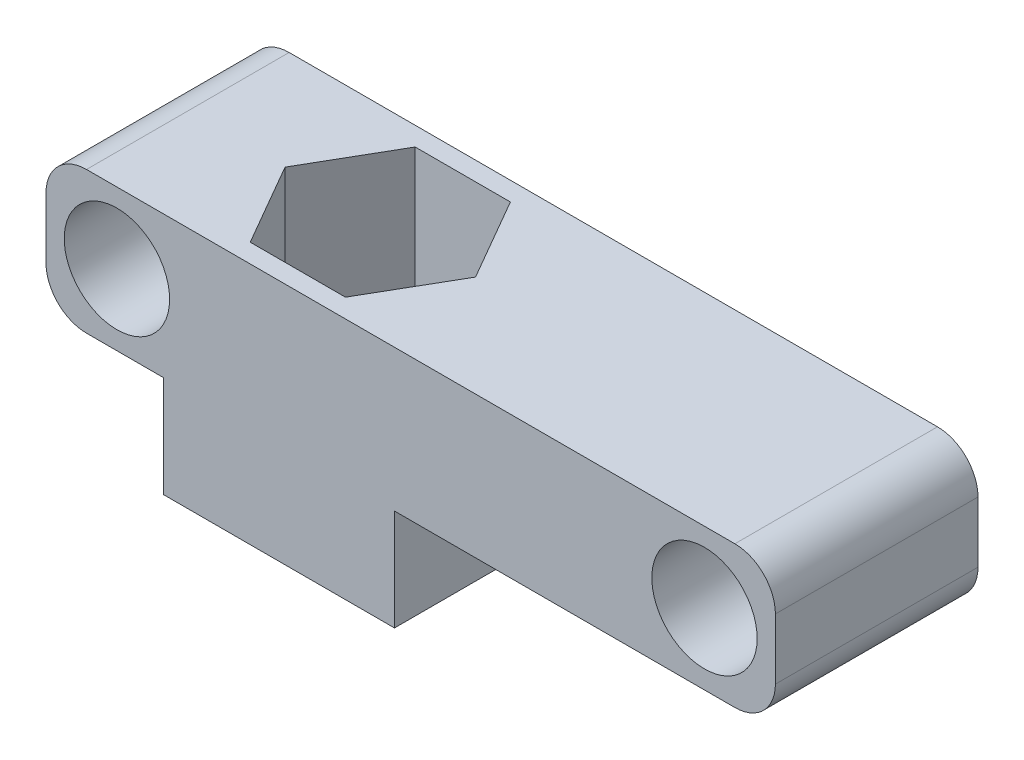
ISO-10303-21;
HEADER;
FILE_DESCRIPTION(('STEP AP214'),'2;1');
FILE_NAME('part.step','',(''),(''),'','','');
FILE_SCHEMA(('AUTOMOTIVE_DESIGN { 1 0 10303 214 1 1 1 1 }'));
ENDSEC;
DATA;
#1=APPLICATION_CONTEXT('core data for automotive mechanical design processes');
#2=APPLICATION_PROTOCOL_DEFINITION('international standard','automotive_design',2000,#1);
#3=PRODUCT_CONTEXT('',#1,'mechanical');
#4=PRODUCT('Part','Part','',(#3));
#5=PRODUCT_RELATED_PRODUCT_CATEGORY('part','',(#4));
#6=PRODUCT_DEFINITION_FORMATION('','',#4);
#7=PRODUCT_DEFINITION_CONTEXT('part definition',#1,'design');
#8=PRODUCT_DEFINITION('design','',#6,#7);
#9=PRODUCT_DEFINITION_SHAPE('','',#8);
#10=(LENGTH_UNIT() NAMED_UNIT(*) SI_UNIT(.MILLI.,.METRE.));
#11=(NAMED_UNIT(*) PLANE_ANGLE_UNIT() SI_UNIT($,.RADIAN.));
#12=(NAMED_UNIT(*) SI_UNIT($,.STERADIAN.) SOLID_ANGLE_UNIT());
#13=UNCERTAINTY_MEASURE_WITH_UNIT(LENGTH_MEASURE(1.E-05),#10,'distance_accuracy_value','');
#14=(GEOMETRIC_REPRESENTATION_CONTEXT(3) GLOBAL_UNCERTAINTY_ASSIGNED_CONTEXT((#13)) GLOBAL_UNIT_ASSIGNED_CONTEXT((#10,
#11,#12)) REPRESENTATION_CONTEXT('',''));
#15=CARTESIAN_POINT('',(0.,0.,0.));
#16=DIRECTION('',(0.,0.,1.));
#17=DIRECTION('',(1.,0.,0.));
#18=AXIS2_PLACEMENT_3D('',#15,#16,#17);
#19=CARTESIAN_POINT('',(-46.016694490818,8.8780487804878,10.));
#20=DIRECTION('',(0.,1.,0.));
#21=DIRECTION('',(0.,0.,1.));
#22=AXIS2_PLACEMENT_3D('',#19,#20,#21);
#23=PLANE('',#22);
#24=DIRECTION('',(1.,0.,0.));
#25=VECTOR('',#24,1.);
#26=CARTESIAN_POINT('',(-46.016694490818,8.8780487804878,10.));
#27=LINE('',#26,#25);
#28=CARTESIAN_POINT('',(-44.016694490818,8.8780487804878,10.));
#29=VERTEX_POINT('',#28);
#30=CARTESIAN_POINT('',(-40.216694490818,8.8780487804878,10.));
#31=VERTEX_POINT('',#30);
#32=EDGE_CURVE('E250',#29,#31,#27,.T.);
#33=ORIENTED_EDGE('',*,*,#32,.F.);
#34=DIRECTION('',(0.,0.,-1.));
#35=VECTOR('',#34,1.);
#36=CARTESIAN_POINT('',(-44.016694490818,8.8780487804878,10.));
#37=LINE('',#36,#35);
#38=CARTESIAN_POINT('',(-44.016694490818,8.8780487804878,0.));
#39=VERTEX_POINT('',#38);
#40=EDGE_CURVE('E272',#29,#39,#37,.T.);
#41=ORIENTED_EDGE('',*,*,#40,.T.);
#42=DIRECTION('',(1.,0.,0.));
#43=VECTOR('',#42,1.);
#44=CARTESIAN_POINT('',(-46.016694490818,8.8780487804878,0.));
#45=LINE('',#44,#43);
#46=CARTESIAN_POINT('',(-40.216694490818,8.8780487804878,0.));
#47=VERTEX_POINT('',#46);
#48=EDGE_CURVE('E231',#39,#47,#45,.T.);
#49=ORIENTED_EDGE('',*,*,#48,.T.);
#50=DIRECTION('',(0.,0.,-1.));
#51=VECTOR('',#50,1.);
#52=CARTESIAN_POINT('',(-40.216694490818,8.8780487804878,10.));
#53=LINE('',#52,#51);
#54=EDGE_CURVE('E197',#31,#47,#53,.T.);
#55=ORIENTED_EDGE('',*,*,#54,.F.);
#56=EDGE_LOOP('',(#33,#41,#49,#55));
#57=FACE_BOUND('',#56,.T.);
#58=ADVANCED_FACE('F33',(#57),#23,.F.);
#59=CARTESIAN_POINT('',(-28.816694490818,8.8780487804878,0.));
#60=VERTEX_POINT('',#59);
#61=CARTESIAN_POINT('',(-12.016694490818,8.8780487804878,0.));
#62=VERTEX_POINT('',#61);
#63=EDGE_CURVE('E235',#60,#62,#45,.T.);
#64=ORIENTED_EDGE('',*,*,#63,.T.);
#65=DIRECTION('',(0.,0.,-1.));
#66=VECTOR('',#65,1.);
#67=CARTESIAN_POINT('',(-12.016694490818,8.8780487804878,10.));
#68=LINE('',#67,#66);
#69=CARTESIAN_POINT('',(-12.016694490818,8.8780487804878,10.));
#70=VERTEX_POINT('',#69);
#71=EDGE_CURVE('E48',#62,#70,#68,.F.);
#72=ORIENTED_EDGE('',*,*,#71,.T.);
#73=CARTESIAN_POINT('',(-28.816694490818,8.8780487804878,10.));
#74=VERTEX_POINT('',#73);
#75=EDGE_CURVE('E247',#74,#70,#27,.T.);
#76=ORIENTED_EDGE('',*,*,#75,.F.);
#77=DIRECTION('',(0.,0.,1.));
#78=VECTOR('',#77,1.);
#79=CARTESIAN_POINT('',(-28.816694490818,8.8780487804878,10.));
#80=LINE('',#79,#78);
#81=EDGE_CURVE('E202',#60,#74,#80,.T.);
#82=ORIENTED_EDGE('',*,*,#81,.F.);
#83=EDGE_LOOP('',(#64,#72,#76,#82));
#84=FACE_BOUND('',#83,.T.);
#85=ADVANCED_FACE('F350',(#84),#23,.F.);
#86=CARTESIAN_POINT('',(0.,0.,10.));
#87=DIRECTION('',(0.,0.,1.));
#88=DIRECTION('',(1.,0.,0.));
#89=AXIS2_PLACEMENT_3D('',#86,#87,#88);
#90=PLANE('',#89);
#91=CARTESIAN_POINT('',(-42.516694490818,12.3780487804878,10.));
#92=DIRECTION('',(0.,0.,1.));
#93=DIRECTION('',(1.,0.,0.));
#94=AXIS2_PLACEMENT_3D('',#91,#92,#93);
#95=CIRCLE('',#94,2.6);
#96=CARTESIAN_POINT('',(-39.916694490818,12.3780487804878,10.));
#97=VERTEX_POINT('',#96);
#98=EDGE_CURVE('E291',#97,#97,#95,.T.);
#99=ORIENTED_EDGE('',*,*,#98,.F.);
#100=EDGE_LOOP('',(#99));
#101=FACE_BOUND('',#100,.T.);
#102=DIRECTION('',(0.,1.,0.));
#103=VECTOR('',#102,1.);
#104=CARTESIAN_POINT('',(-10.016694490818,15.8780487804878,10.));
#105=LINE('',#104,#103);
#106=CARTESIAN_POINT('',(-10.016694490818,10.8780487804878,10.));
#107=VERTEX_POINT('',#106);
#108=CARTESIAN_POINT('',(-10.016694490818,13.8780487804878,10.));
#109=VERTEX_POINT('',#108);
#110=EDGE_CURVE('E257',#107,#109,#105,.T.);
#111=ORIENTED_EDGE('',*,*,#110,.T.);
#112=CARTESIAN_POINT('',(-12.016694490818,13.8780487804878,10.));
#113=DIRECTION('',(0.,0.,1.));
#114=DIRECTION('',(1.,0.,0.));
#115=AXIS2_PLACEMENT_3D('',#112,#113,#114);
#116=CIRCLE('',#115,2.);
#117=CARTESIAN_POINT('',(-12.016694490818,15.8780487804878,10.));
#118=VERTEX_POINT('',#117);
#119=EDGE_CURVE('E269',#109,#118,#116,.T.);
#120=ORIENTED_EDGE('',*,*,#119,.T.);
#121=DIRECTION('',(-1.,0.,0.));
#122=VECTOR('',#121,1.);
#123=CARTESIAN_POINT('',(-46.016694490818,15.8780487804878,10.));
#124=LINE('',#123,#122);
#125=CARTESIAN_POINT('',(-44.016694490818,15.8780487804878,10.));
#126=VERTEX_POINT('',#125);
#127=EDGE_CURVE('E227',#118,#126,#124,.T.);
#128=ORIENTED_EDGE('',*,*,#127,.T.);
#129=CARTESIAN_POINT('',(-44.016694490818,13.8780487804878,10.));
#130=DIRECTION('',(0.,0.,1.));
#131=DIRECTION('',(1.,0.,0.));
#132=AXIS2_PLACEMENT_3D('',#129,#130,#131);
#133=CIRCLE('',#132,2.);
#134=CARTESIAN_POINT('',(-46.016694490818,13.8780487804878,10.));
#135=VERTEX_POINT('',#134);
#136=EDGE_CURVE('E264',#126,#135,#133,.T.);
#137=ORIENTED_EDGE('',*,*,#136,.T.);
#138=DIRECTION('',(0.,-1.,0.));
#139=VECTOR('',#138,1.);
#140=CARTESIAN_POINT('',(-46.016694490818,15.8780487804878,10.));
#141=LINE('',#140,#139);
#142=CARTESIAN_POINT('',(-46.016694490818,10.8780487804878,10.));
#143=VERTEX_POINT('',#142);
#144=EDGE_CURVE('E251',#135,#143,#141,.T.);
#145=ORIENTED_EDGE('',*,*,#144,.T.);
#146=CARTESIAN_POINT('',(-44.016694490818,10.8780487804878,10.));
#147=DIRECTION('',(0.,0.,1.));
#148=DIRECTION('',(1.,0.,0.));
#149=AXIS2_PLACEMENT_3D('',#146,#147,#148);
#150=CIRCLE('',#149,2.);
#151=EDGE_CURVE('E56',#143,#29,#150,.T.);
#152=ORIENTED_EDGE('',*,*,#151,.T.);
#153=ORIENTED_EDGE('',*,*,#32,.T.);
#154=DIRECTION('',(0.,1.,0.));
#155=VECTOR('',#154,1.);
#156=CARTESIAN_POINT('',(-40.216694490818,3.8780487804878,10.));
#157=LINE('',#156,#155);
#158=CARTESIAN_POINT('',(-40.216694490818,3.8780487804878,10.));
#159=VERTEX_POINT('',#158);
#160=EDGE_CURVE('E208',#159,#31,#157,.T.);
#161=ORIENTED_EDGE('',*,*,#160,.F.);
#162=DIRECTION('',(-1.,0.,0.));
#163=VECTOR('',#162,1.);
#164=CARTESIAN_POINT('',(-40.216694490818,3.8780487804878,10.));
#165=LINE('',#164,#163);
#166=CARTESIAN_POINT('',(-28.816694490818,3.8780487804878,10.));
#167=VERTEX_POINT('',#166);
#168=EDGE_CURVE('E206',#167,#159,#165,.T.);
#169=ORIENTED_EDGE('',*,*,#168,.F.);
#170=DIRECTION('',(0.,1.,0.));
#171=VECTOR('',#170,1.);
#172=CARTESIAN_POINT('',(-28.816694490818,3.8780487804878,10.));
#173=LINE('',#172,#171);
#174=EDGE_CURVE('E221',#167,#74,#173,.T.);
#175=ORIENTED_EDGE('',*,*,#174,.T.);
#176=ORIENTED_EDGE('',*,*,#75,.T.);
#177=CARTESIAN_POINT('',(-12.016694490818,10.8780487804878,10.));
#178=DIRECTION('',(0.,0.,1.));
#179=DIRECTION('',(1.,0.,0.));
#180=AXIS2_PLACEMENT_3D('',#177,#178,#179);
#181=CIRCLE('',#180,2.);
#182=EDGE_CURVE('E267',#70,#107,#181,.T.);
#183=ORIENTED_EDGE('',*,*,#182,.T.);
#184=EDGE_LOOP('',(#111,#120,#128,#137,#145,#152,#153,#161,#169,#175,#176,#183));
#185=FACE_BOUND('',#184,.T.);
#186=CARTESIAN_POINT('',(-13.516694490818,12.3780487804878,10.));
#187=DIRECTION('',(0.,0.,1.));
#188=DIRECTION('',(1.,0.,0.));
#189=AXIS2_PLACEMENT_3D('',#186,#187,#188);
#190=CIRCLE('',#189,2.6);
#191=CARTESIAN_POINT('',(-10.916694490818,12.3780487804878,10.));
#192=VERTEX_POINT('',#191);
#193=EDGE_CURVE('E298',#192,#192,#190,.T.);
#194=ORIENTED_EDGE('',*,*,#193,.F.);
#195=EDGE_LOOP('',(#194));
#196=FACE_BOUND('',#195,.T.);
#197=ADVANCED_FACE('F340',(#101,#185,#196),#90,.T.);
#198=CARTESIAN_POINT('',(0.,0.,0.));
#199=DIRECTION('',(0.,0.,1.));
#200=DIRECTION('',(1.,0.,0.));
#201=AXIS2_PLACEMENT_3D('',#198,#199,#200);
#202=PLANE('',#201);
#203=DIRECTION('',(-1.,0.,0.));
#204=VECTOR('',#203,1.);
#205=CARTESIAN_POINT('',(-46.016694490818,15.8780487804878,0.));
#206=LINE('',#205,#204);
#207=CARTESIAN_POINT('',(-12.016694490818,15.8780487804878,0.));
#208=VERTEX_POINT('',#207);
#209=CARTESIAN_POINT('',(-44.016694490818,15.8780487804878,0.));
#210=VERTEX_POINT('',#209);
#211=EDGE_CURVE('E246',#208,#210,#206,.T.);
#212=ORIENTED_EDGE('',*,*,#211,.F.);
#213=CARTESIAN_POINT('',(-12.016694490818,13.8780487804878,0.));
#214=DIRECTION('',(0.,0.,1.));
#215=DIRECTION('',(1.,0.,0.));
#216=AXIS2_PLACEMENT_3D('',#213,#214,#215);
#217=CIRCLE('',#216,2.);
#218=CARTESIAN_POINT('',(-10.016694490818,13.8780487804878,0.));
#219=VERTEX_POINT('',#218);
#220=EDGE_CURVE('E357',#208,#219,#217,.F.);
#221=ORIENTED_EDGE('',*,*,#220,.T.);
#222=DIRECTION('',(0.,1.,0.));
#223=VECTOR('',#222,1.);
#224=CARTESIAN_POINT('',(-10.016694490818,15.8780487804878,0.));
#225=LINE('',#224,#223);
#226=CARTESIAN_POINT('',(-10.016694490818,10.8780487804878,0.));
#227=VERTEX_POINT('',#226);
#228=EDGE_CURVE('E234',#227,#219,#225,.T.);
#229=ORIENTED_EDGE('',*,*,#228,.F.);
#230=CARTESIAN_POINT('',(-12.016694490818,10.8780487804878,0.));
#231=DIRECTION('',(0.,0.,1.));
#232=DIRECTION('',(1.,0.,0.));
#233=AXIS2_PLACEMENT_3D('',#230,#231,#232);
#234=CIRCLE('',#233,2.);
#235=EDGE_CURVE('E352',#227,#62,#234,.F.);
#236=ORIENTED_EDGE('',*,*,#235,.T.);
#237=ORIENTED_EDGE('',*,*,#63,.F.);
#238=DIRECTION('',(0.,1.,0.));
#239=VECTOR('',#238,1.);
#240=CARTESIAN_POINT('',(-28.816694490818,3.8780487804878,0.));
#241=LINE('',#240,#239);
#242=CARTESIAN_POINT('',(-28.816694490818,3.8780487804878,0.));
#243=VERTEX_POINT('',#242);
#244=EDGE_CURVE('E328',#243,#60,#241,.T.);
#245=ORIENTED_EDGE('',*,*,#244,.F.);
#246=DIRECTION('',(1.,0.,0.));
#247=VECTOR('',#246,1.);
#248=CARTESIAN_POINT('',(-40.216694490818,3.8780487804878,0.));
#249=LINE('',#248,#247);
#250=CARTESIAN_POINT('',(-40.216694490818,3.8780487804878,0.));
#251=VERTEX_POINT('',#250);
#252=EDGE_CURVE('E201',#251,#243,#249,.T.);
#253=ORIENTED_EDGE('',*,*,#252,.F.);
#254=DIRECTION('',(0.,1.,0.));
#255=VECTOR('',#254,1.);
#256=CARTESIAN_POINT('',(-40.216694490818,3.8780487804878,0.));
#257=LINE('',#256,#255);
#258=EDGE_CURVE('E325',#251,#47,#257,.T.);
#259=ORIENTED_EDGE('',*,*,#258,.T.);
#260=ORIENTED_EDGE('',*,*,#48,.F.);
#261=CARTESIAN_POINT('',(-44.016694490818,10.8780487804878,0.));
#262=DIRECTION('',(0.,0.,1.));
#263=DIRECTION('',(1.,0.,0.));
#264=AXIS2_PLACEMENT_3D('',#261,#262,#263);
#265=CIRCLE('',#264,2.);
#266=CARTESIAN_POINT('',(-46.016694490818,10.8780487804878,0.));
#267=VERTEX_POINT('',#266);
#268=EDGE_CURVE('E290',#39,#267,#265,.F.);
#269=ORIENTED_EDGE('',*,*,#268,.T.);
#270=DIRECTION('',(0.,-1.,0.));
#271=VECTOR('',#270,1.);
#272=CARTESIAN_POINT('',(-46.016694490818,15.8780487804878,0.));
#273=LINE('',#272,#271);
#274=CARTESIAN_POINT('',(-46.016694490818,13.8780487804878,0.));
#275=VERTEX_POINT('',#274);
#276=EDGE_CURVE('E240',#275,#267,#273,.T.);
#277=ORIENTED_EDGE('',*,*,#276,.F.);
#278=CARTESIAN_POINT('',(-44.016694490818,13.8780487804878,0.));
#279=DIRECTION('',(0.,0.,1.));
#280=DIRECTION('',(1.,0.,0.));
#281=AXIS2_PLACEMENT_3D('',#278,#279,#280);
#282=CIRCLE('',#281,2.);
#283=EDGE_CURVE('E230',#275,#210,#282,.F.);
#284=ORIENTED_EDGE('',*,*,#283,.T.);
#285=EDGE_LOOP('',(#212,#221,#229,#236,#237,#245,#253,#259,#260,#269,#277,#284));
#286=FACE_BOUND('',#285,.T.);
#287=CARTESIAN_POINT('',(-42.516694490818,12.3780487804878,0.));
#288=DIRECTION('',(0.,0.,1.));
#289=DIRECTION('',(1.,0.,0.));
#290=AXIS2_PLACEMENT_3D('',#287,#288,#289);
#291=CIRCLE('',#290,2.6);
#292=CARTESIAN_POINT('',(-39.916694490818,12.3780487804878,0.));
#293=VERTEX_POINT('',#292);
#294=EDGE_CURVE('E293',#293,#293,#291,.T.);
#295=ORIENTED_EDGE('',*,*,#294,.T.);
#296=EDGE_LOOP('',(#295));
#297=FACE_BOUND('',#296,.T.);
#298=CARTESIAN_POINT('',(-13.516694490818,12.3780487804878,0.));
#299=DIRECTION('',(0.,0.,1.));
#300=DIRECTION('',(1.,0.,0.));
#301=AXIS2_PLACEMENT_3D('',#298,#299,#300);
#302=CIRCLE('',#301,2.6);
#303=CARTESIAN_POINT('',(-10.916694490818,12.3780487804878,0.));
#304=VERTEX_POINT('',#303);
#305=EDGE_CURVE('E300',#304,#304,#302,.T.);
#306=ORIENTED_EDGE('',*,*,#305,.T.);
#307=EDGE_LOOP('',(#306));
#308=FACE_BOUND('',#307,.T.);
#309=ADVANCED_FACE('F286',(#286,#297,#308),#202,.F.);
#310=CARTESIAN_POINT('',(-46.016694490818,15.8780487804878,10.));
#311=DIRECTION('',(1.,0.,0.));
#312=DIRECTION('',(0.,0.,-1.));
#313=AXIS2_PLACEMENT_3D('',#310,#311,#312);
#314=PLANE('',#313);
#315=ORIENTED_EDGE('',*,*,#276,.T.);
#316=DIRECTION('',(0.,0.,-1.));
#317=VECTOR('',#316,1.);
#318=CARTESIAN_POINT('',(-46.016694490818,10.8780487804878,10.));
#319=LINE('',#318,#317);
#320=EDGE_CURVE('E11',#267,#143,#319,.F.);
#321=ORIENTED_EDGE('',*,*,#320,.T.);
#322=ORIENTED_EDGE('',*,*,#144,.F.);
#323=DIRECTION('',(0.,0.,-1.));
#324=VECTOR('',#323,1.);
#325=CARTESIAN_POINT('',(-46.016694490818,13.8780487804878,10.));
#326=LINE('',#325,#324);
#327=EDGE_CURVE('E41',#135,#275,#326,.T.);
#328=ORIENTED_EDGE('',*,*,#327,.T.);
#329=EDGE_LOOP('',(#315,#321,#322,#328));
#330=FACE_BOUND('',#329,.T.);
#331=ADVANCED_FACE('F280',(#330),#314,.F.);
#332=CARTESIAN_POINT('',(-10.016694490818,15.8780487804878,10.));
#333=DIRECTION('',(-1.,0.,0.));
#334=DIRECTION('',(0.,-1.,0.));
#335=AXIS2_PLACEMENT_3D('',#332,#333,#334);
#336=PLANE('',#335);
#337=ORIENTED_EDGE('',*,*,#228,.T.);
#338=DIRECTION('',(0.,0.,-1.));
#339=VECTOR('',#338,1.);
#340=CARTESIAN_POINT('',(-10.016694490818,13.8780487804878,10.));
#341=LINE('',#340,#339);
#342=EDGE_CURVE('E262',#219,#109,#341,.F.);
#343=ORIENTED_EDGE('',*,*,#342,.T.);
#344=ORIENTED_EDGE('',*,*,#110,.F.);
#345=DIRECTION('',(0.,0.,-1.));
#346=VECTOR('',#345,1.);
#347=CARTESIAN_POINT('',(-10.016694490818,10.8780487804878,10.));
#348=LINE('',#347,#346);
#349=EDGE_CURVE('E359',#107,#227,#348,.T.);
#350=ORIENTED_EDGE('',*,*,#349,.T.);
#351=EDGE_LOOP('',(#337,#343,#344,#350));
#352=FACE_BOUND('',#351,.T.);
#353=ADVANCED_FACE('F364',(#352),#336,.F.);
#354=CARTESIAN_POINT('',(-46.016694490818,15.8780487804878,10.));
#355=DIRECTION('',(0.,-1.,0.));
#356=DIRECTION('',(0.,0.,-1.));
#357=AXIS2_PLACEMENT_3D('',#354,#355,#356);
#358=PLANE('',#357);
#359=DIRECTION('',(1.,0.,0.));
#360=VECTOR('',#359,1.);
#361=CARTESIAN_POINT('',(-36.866694490818,15.8780487804878,0.929680602213117));
#362=LINE('',#361,#360);
#363=CARTESIAN_POINT('',(-36.866694490818,15.8780487804878,0.929680602213117));
#364=VERTEX_POINT('',#363);
#365=CARTESIAN_POINT('',(-32.166694490818,15.8780487804878,0.929680602213166));
#366=VERTEX_POINT('',#365);
#367=EDGE_CURVE('E172',#364,#366,#362,.T.);
#368=ORIENTED_EDGE('',*,*,#367,.T.);
#369=DIRECTION('',(0.499999999999995,0.,0.866025403784441));
#370=VECTOR('',#369,1.);
#371=CARTESIAN_POINT('',(-32.166694490818,15.8780487804878,0.929680602213166));
#372=LINE('',#371,#370);
#373=CARTESIAN_POINT('',(-29.816694490818,15.8780487804878,5.));
#374=VERTEX_POINT('',#373);
#375=EDGE_CURVE('E324',#366,#374,#372,.T.);
#376=ORIENTED_EDGE('',*,*,#375,.T.);
#377=DIRECTION('',(-0.500000000000001,0.,0.866025403784438));
#378=VECTOR('',#377,1.);
#379=CARTESIAN_POINT('',(-29.816694490818,15.8780487804878,5.));
#380=LINE('',#379,#378);
#381=CARTESIAN_POINT('',(-32.166694490818,15.8780487804878,9.07031939778687));
#382=VERTEX_POINT('',#381);
#383=EDGE_CURVE('E167',#374,#382,#380,.T.);
#384=ORIENTED_EDGE('',*,*,#383,.T.);
#385=DIRECTION('',(-1.,0.,0.));
#386=VECTOR('',#385,1.);
#387=CARTESIAN_POINT('',(-32.166694490818,15.8780487804878,9.07031939778687));
#388=LINE('',#387,#386);
#389=CARTESIAN_POINT('',(-36.866694490818,15.8780487804878,9.07031939778685));
#390=VERTEX_POINT('',#389);
#391=EDGE_CURVE('E321',#382,#390,#388,.T.);
#392=ORIENTED_EDGE('',*,*,#391,.T.);
#393=DIRECTION('',(-0.499999999999995,0.,-0.866025403784442));
#394=VECTOR('',#393,1.);
#395=CARTESIAN_POINT('',(-36.866694490818,15.8780487804878,9.07031939778685));
#396=LINE('',#395,#394);
#397=CARTESIAN_POINT('',(-39.216694490818,15.8780487804878,4.99999999999997));
#398=VERTEX_POINT('',#397);
#399=EDGE_CURVE('E318',#390,#398,#396,.T.);
#400=ORIENTED_EDGE('',*,*,#399,.T.);
#401=DIRECTION('',(0.500000000000006,0.,-0.866025403784435));
#402=VECTOR('',#401,1.);
#403=CARTESIAN_POINT('',(-39.216694490818,15.8780487804878,4.99999999999997));
#404=LINE('',#403,#402);
#405=EDGE_CURVE('E315',#398,#364,#404,.T.);
#406=ORIENTED_EDGE('',*,*,#405,.T.);
#407=EDGE_LOOP('',(#368,#376,#384,#392,#400,#406));
#408=FACE_BOUND('',#407,.T.);
#409=ORIENTED_EDGE('',*,*,#127,.F.);
#410=DIRECTION('',(0.,0.,-1.));
#411=VECTOR('',#410,1.);
#412=CARTESIAN_POINT('',(-12.016694490818,15.8780487804878,10.));
#413=LINE('',#412,#411);
#414=EDGE_CURVE('E226',#118,#208,#413,.T.);
#415=ORIENTED_EDGE('',*,*,#414,.T.);
#416=ORIENTED_EDGE('',*,*,#211,.T.);
#417=DIRECTION('',(0.,0.,-1.));
#418=VECTOR('',#417,1.);
#419=CARTESIAN_POINT('',(-44.016694490818,15.8780487804878,10.));
#420=LINE('',#419,#418);
#421=EDGE_CURVE('E224',#210,#126,#420,.F.);
#422=ORIENTED_EDGE('',*,*,#421,.T.);
#423=EDGE_LOOP('',(#409,#415,#416,#422));
#424=FACE_BOUND('',#423,.T.);
#425=ADVANCED_FACE('F372',(#408,#424),#358,.F.);
#426=CARTESIAN_POINT('',(-42.516694490818,12.3780487804878,10.));
#427=DIRECTION('',(0.,0.,-1.));
#428=DIRECTION('',(-1.,0.,0.));
#429=AXIS2_PLACEMENT_3D('',#426,#427,#428);
#430=CYLINDRICAL_SURFACE('',#429,2.6);
#431=ORIENTED_EDGE('',*,*,#98,.T.);
#432=EDGE_LOOP('',(#431));
#433=FACE_BOUND('',#432,.T.);
#434=ORIENTED_EDGE('',*,*,#294,.F.);
#435=EDGE_LOOP('',(#434));
#436=FACE_BOUND('',#435,.T.);
#437=ADVANCED_FACE('F440',(#433,#436),#430,.F.);
#438=CARTESIAN_POINT('',(-13.516694490818,12.3780487804878,10.));
#439=DIRECTION('',(0.,0.,-1.));
#440=DIRECTION('',(-1.,0.,0.));
#441=AXIS2_PLACEMENT_3D('',#438,#439,#440);
#442=CYLINDRICAL_SURFACE('',#441,2.6);
#443=ORIENTED_EDGE('',*,*,#193,.T.);
#444=EDGE_LOOP('',(#443));
#445=FACE_BOUND('',#444,.T.);
#446=ORIENTED_EDGE('',*,*,#305,.F.);
#447=EDGE_LOOP('',(#446));
#448=FACE_BOUND('',#447,.T.);
#449=ADVANCED_FACE('F557',(#445,#448),#442,.F.);
#450=CARTESIAN_POINT('',(-32.166694490818,15.8780487804878,0.929680602213166));
#451=DIRECTION('',(0.866025403784441,0.,-0.499999999999995));
#452=DIRECTION('',(-0.499999999999995,0.,-0.866025403784442));
#453=AXIS2_PLACEMENT_3D('',#450,#451,#452);
#454=PLANE('',#453);
#455=DIRECTION('',(0.,-1.,0.));
#456=VECTOR('',#455,1.);
#457=CARTESIAN_POINT('',(-32.166694490818,15.8780487804878,0.929680602213166));
#458=LINE('',#457,#456);
#459=CARTESIAN_POINT('',(-32.1666944908179,3.8780487804878,0.929680602213183));
#460=VERTEX_POINT('',#459);
#461=EDGE_CURVE('E177',#366,#460,#458,.T.);
#462=ORIENTED_EDGE('',*,*,#461,.T.);
#463=DIRECTION('',(0.499999999999994,0.,0.866025403784442));
#464=VECTOR('',#463,1.);
#465=CARTESIAN_POINT('',(-32.1666944908179,3.8780487804878,0.929680602213183));
#466=LINE('',#465,#464);
#467=CARTESIAN_POINT('',(-29.816694490818,3.8780487804878,5.));
#468=VERTEX_POINT('',#467);
#469=EDGE_CURVE('E175',#460,#468,#466,.T.);
#470=ORIENTED_EDGE('',*,*,#469,.T.);
#471=DIRECTION('',(0.,-1.,0.));
#472=VECTOR('',#471,1.);
#473=CARTESIAN_POINT('',(-29.816694490818,15.8780487804878,5.));
#474=LINE('',#473,#472);
#475=EDGE_CURVE('E159',#374,#468,#474,.T.);
#476=ORIENTED_EDGE('',*,*,#475,.F.);
#477=ORIENTED_EDGE('',*,*,#375,.F.);
#478=EDGE_LOOP('',(#462,#470,#476,#477));
#479=FACE_BOUND('',#478,.T.);
#480=ADVANCED_FACE('F176',(#479),#454,.F.);
#481=CARTESIAN_POINT('',(-36.866694490818,15.8780487804878,0.929680602213117));
#482=DIRECTION('',(0.,0.,-1.));
#483=DIRECTION('',(-1.,0.,0.));
#484=AXIS2_PLACEMENT_3D('',#481,#482,#483);
#485=PLANE('',#484);
#486=DIRECTION('',(0.,-1.,0.));
#487=VECTOR('',#486,1.);
#488=CARTESIAN_POINT('',(-36.866694490818,15.8780487804878,0.929680602213117));
#489=LINE('',#488,#487);
#490=CARTESIAN_POINT('',(-36.8666944908179,3.8780487804878,0.929680602213135));
#491=VERTEX_POINT('',#490);
#492=EDGE_CURVE('E310',#364,#491,#489,.T.);
#493=ORIENTED_EDGE('',*,*,#492,.T.);
#494=DIRECTION('',(1.,0.,0.));
#495=VECTOR('',#494,1.);
#496=CARTESIAN_POINT('',(-36.8666944908179,3.8780487804878,0.929680602213135));
#497=LINE('',#496,#495);
#498=EDGE_CURVE('E195',#491,#460,#497,.T.);
#499=ORIENTED_EDGE('',*,*,#498,.T.);
#500=ORIENTED_EDGE('',*,*,#461,.F.);
#501=ORIENTED_EDGE('',*,*,#367,.F.);
#502=EDGE_LOOP('',(#493,#499,#500,#501));
#503=FACE_BOUND('',#502,.T.);
#504=ADVANCED_FACE('F537',(#503),#485,.F.);
#505=CARTESIAN_POINT('',(-39.216694490818,15.8780487804878,4.99999999999997));
#506=DIRECTION('',(-0.866025403784435,0.,-0.500000000000006));
#507=DIRECTION('',(-0.500000000000006,0.,0.866025403784435));
#508=AXIS2_PLACEMENT_3D('',#505,#506,#507);
#509=PLANE('',#508);
#510=DIRECTION('',(0.,-1.,0.));
#511=VECTOR('',#510,1.);
#512=CARTESIAN_POINT('',(-39.216694490818,15.8780487804878,4.99999999999997));
#513=LINE('',#512,#511);
#514=CARTESIAN_POINT('',(-39.216694490818,3.8780487804878,4.99999999999997));
#515=VERTEX_POINT('',#514);
#516=EDGE_CURVE('E308',#398,#515,#513,.T.);
#517=ORIENTED_EDGE('',*,*,#516,.T.);
#518=DIRECTION('',(0.500000000000008,0.,-0.866025403784434));
#519=VECTOR('',#518,1.);
#520=CARTESIAN_POINT('',(-39.216694490818,3.8780487804878,4.99999999999997));
#521=LINE('',#520,#519);
#522=EDGE_CURVE('E192',#515,#491,#521,.T.);
#523=ORIENTED_EDGE('',*,*,#522,.T.);
#524=ORIENTED_EDGE('',*,*,#492,.F.);
#525=ORIENTED_EDGE('',*,*,#405,.F.);
#526=EDGE_LOOP('',(#517,#523,#524,#525));
#527=FACE_BOUND('',#526,.T.);
#528=ADVANCED_FACE('F526',(#527),#509,.F.);
#529=CARTESIAN_POINT('',(-36.866694490818,15.8780487804878,9.07031939778685));
#530=DIRECTION('',(-0.866025403784442,0.,0.499999999999995));
#531=DIRECTION('',(0.499999999999995,0.,0.866025403784442));
#532=AXIS2_PLACEMENT_3D('',#529,#530,#531);
#533=PLANE('',#532);
#534=DIRECTION('',(0.,-1.,0.));
#535=VECTOR('',#534,1.);
#536=CARTESIAN_POINT('',(-36.866694490818,15.8780487804878,9.07031939778685));
#537=LINE('',#536,#535);
#538=CARTESIAN_POINT('',(-36.866694490818,3.8780487804878,9.07031939778683));
#539=VERTEX_POINT('',#538);
#540=EDGE_CURVE('E306',#390,#539,#537,.T.);
#541=ORIENTED_EDGE('',*,*,#540,.T.);
#542=DIRECTION('',(-0.499999999999996,0.,-0.866025403784441));
#543=VECTOR('',#542,1.);
#544=CARTESIAN_POINT('',(-36.866694490818,3.8780487804878,9.07031939778683));
#545=LINE('',#544,#543);
#546=EDGE_CURVE('E187',#539,#515,#545,.T.);
#547=ORIENTED_EDGE('',*,*,#546,.T.);
#548=ORIENTED_EDGE('',*,*,#516,.F.);
#549=ORIENTED_EDGE('',*,*,#399,.F.);
#550=EDGE_LOOP('',(#541,#547,#548,#549));
#551=FACE_BOUND('',#550,.T.);
#552=ADVANCED_FACE('F515',(#551),#533,.F.);
#553=CARTESIAN_POINT('',(-32.166694490818,15.8780487804878,9.07031939778687));
#554=DIRECTION('',(0.,0.,1.));
#555=DIRECTION('',(1.,0.,0.));
#556=AXIS2_PLACEMENT_3D('',#553,#554,#555);
#557=PLANE('',#556);
#558=DIRECTION('',(0.,-1.,0.));
#559=VECTOR('',#558,1.);
#560=CARTESIAN_POINT('',(-32.166694490818,15.8780487804878,9.07031939778687));
#561=LINE('',#560,#559);
#562=CARTESIAN_POINT('',(-32.166694490818,3.8780487804878,9.07031939778685));
#563=VERTEX_POINT('',#562);
#564=EDGE_CURVE('E171',#382,#563,#561,.T.);
#565=ORIENTED_EDGE('',*,*,#564,.T.);
#566=DIRECTION('',(-1.,0.,0.));
#567=VECTOR('',#566,1.);
#568=CARTESIAN_POINT('',(-32.166694490818,3.8780487804878,9.07031939778685));
#569=LINE('',#568,#567);
#570=EDGE_CURVE('E185',#563,#539,#569,.T.);
#571=ORIENTED_EDGE('',*,*,#570,.T.);
#572=ORIENTED_EDGE('',*,*,#540,.F.);
#573=ORIENTED_EDGE('',*,*,#391,.F.);
#574=EDGE_LOOP('',(#565,#571,#572,#573));
#575=FACE_BOUND('',#574,.T.);
#576=ADVANCED_FACE('F390',(#575),#557,.F.);
#577=CARTESIAN_POINT('',(-29.816694490818,15.8780487804878,5.));
#578=DIRECTION('',(0.866025403784438,0.,0.500000000000001));
#579=DIRECTION('',(0.500000000000001,0.,-0.866025403784438));
#580=AXIS2_PLACEMENT_3D('',#577,#578,#579);
#581=PLANE('',#580);
#582=ORIENTED_EDGE('',*,*,#475,.T.);
#583=DIRECTION('',(-0.500000000000001,0.,0.866025403784438));
#584=VECTOR('',#583,1.);
#585=CARTESIAN_POINT('',(-29.816694490818,3.8780487804878,5.));
#586=LINE('',#585,#584);
#587=EDGE_CURVE('E164',#468,#563,#586,.T.);
#588=ORIENTED_EDGE('',*,*,#587,.T.);
#589=ORIENTED_EDGE('',*,*,#564,.F.);
#590=ORIENTED_EDGE('',*,*,#383,.F.);
#591=EDGE_LOOP('',(#582,#588,#589,#590));
#592=FACE_BOUND('',#591,.T.);
#593=ADVANCED_FACE('F161',(#592),#581,.F.);
#594=CARTESIAN_POINT('',(0.,3.8780487804878,0.));
#595=DIRECTION('',(0.,-1.,0.));
#596=DIRECTION('',(0.,0.,-1.));
#597=AXIS2_PLACEMENT_3D('',#594,#595,#596);
#598=PLANE('',#597);
#599=DIRECTION('',(0.,0.,-1.));
#600=VECTOR('',#599,1.);
#601=CARTESIAN_POINT('',(-40.216694490818,3.8780487804878,10.));
#602=LINE('',#601,#600);
#603=EDGE_CURVE('E198',#159,#251,#602,.T.);
#604=ORIENTED_EDGE('',*,*,#603,.T.);
#605=ORIENTED_EDGE('',*,*,#252,.T.);
#606=DIRECTION('',(0.,0.,1.));
#607=VECTOR('',#606,1.);
#608=CARTESIAN_POINT('',(-28.816694490818,3.8780487804878,10.));
#609=LINE('',#608,#607);
#610=EDGE_CURVE('E204',#243,#167,#609,.T.);
#611=ORIENTED_EDGE('',*,*,#610,.T.);
#612=ORIENTED_EDGE('',*,*,#168,.T.);
#613=EDGE_LOOP('',(#604,#605,#611,#612));
#614=FACE_BOUND('',#613,.T.);
#615=ORIENTED_EDGE('',*,*,#587,.F.);
#616=ORIENTED_EDGE('',*,*,#469,.F.);
#617=ORIENTED_EDGE('',*,*,#498,.F.);
#618=ORIENTED_EDGE('',*,*,#522,.F.);
#619=ORIENTED_EDGE('',*,*,#546,.F.);
#620=ORIENTED_EDGE('',*,*,#570,.F.);
#621=EDGE_LOOP('',(#615,#616,#617,#618,#619,#620));
#622=FACE_BOUND('',#621,.T.);
#623=ADVANCED_FACE('F182',(#614,#622),#598,.T.);
#624=CARTESIAN_POINT('',(-40.216694490818,3.8780487804878,10.));
#625=DIRECTION('',(1.,0.,0.));
#626=DIRECTION('',(0.,0.,-1.));
#627=AXIS2_PLACEMENT_3D('',#624,#625,#626);
#628=PLANE('',#627);
#629=ORIENTED_EDGE('',*,*,#54,.T.);
#630=ORIENTED_EDGE('',*,*,#258,.F.);
#631=ORIENTED_EDGE('',*,*,#603,.F.);
#632=ORIENTED_EDGE('',*,*,#160,.T.);
#633=EDGE_LOOP('',(#629,#630,#631,#632));
#634=FACE_BOUND('',#633,.T.);
#635=ADVANCED_FACE('F381',(#634),#628,.F.);
#636=CARTESIAN_POINT('',(-28.816694490818,3.8780487804878,10.));
#637=DIRECTION('',(-1.,0.,0.));
#638=DIRECTION('',(0.,0.,1.));
#639=AXIS2_PLACEMENT_3D('',#636,#637,#638);
#640=PLANE('',#639);
#641=ORIENTED_EDGE('',*,*,#81,.T.);
#642=ORIENTED_EDGE('',*,*,#174,.F.);
#643=ORIENTED_EDGE('',*,*,#610,.F.);
#644=ORIENTED_EDGE('',*,*,#244,.T.);
#645=EDGE_LOOP('',(#641,#642,#643,#644));
#646=FACE_BOUND('',#645,.T.);
#647=ADVANCED_FACE('F347',(#646),#640,.F.);
#648=CARTESIAN_POINT('',(-12.016694490818,13.8780487804878,10.));
#649=DIRECTION('',(0.,0.,-1.));
#650=DIRECTION('',(-1.,0.,0.));
#651=AXIS2_PLACEMENT_3D('',#648,#649,#650);
#652=CYLINDRICAL_SURFACE('',#651,2.);
#653=ORIENTED_EDGE('',*,*,#119,.F.);
#654=ORIENTED_EDGE('',*,*,#342,.F.);
#655=ORIENTED_EDGE('',*,*,#220,.F.);
#656=ORIENTED_EDGE('',*,*,#414,.F.);
#657=EDGE_LOOP('',(#653,#654,#655,#656));
#658=FACE_BOUND('',#657,.T.);
#659=ADVANCED_FACE('F370',(#658),#652,.T.);
#660=CARTESIAN_POINT('',(-12.016694490818,10.8780487804878,10.));
#661=DIRECTION('',(0.,0.,-1.));
#662=DIRECTION('',(-1.,0.,0.));
#663=AXIS2_PLACEMENT_3D('',#660,#661,#662);
#664=CYLINDRICAL_SURFACE('',#663,2.);
#665=ORIENTED_EDGE('',*,*,#182,.F.);
#666=ORIENTED_EDGE('',*,*,#71,.F.);
#667=ORIENTED_EDGE('',*,*,#235,.F.);
#668=ORIENTED_EDGE('',*,*,#349,.F.);
#669=EDGE_LOOP('',(#665,#666,#667,#668));
#670=FACE_BOUND('',#669,.T.);
#671=ADVANCED_FACE('F405',(#670),#664,.T.);
#672=CARTESIAN_POINT('',(-44.016694490818,10.8780487804878,10.));
#673=DIRECTION('',(0.,0.,-1.));
#674=DIRECTION('',(-1.,0.,0.));
#675=AXIS2_PLACEMENT_3D('',#672,#673,#674);
#676=CYLINDRICAL_SURFACE('',#675,2.);
#677=ORIENTED_EDGE('',*,*,#151,.F.);
#678=ORIENTED_EDGE('',*,*,#320,.F.);
#679=ORIENTED_EDGE('',*,*,#268,.F.);
#680=ORIENTED_EDGE('',*,*,#40,.F.);
#681=EDGE_LOOP('',(#677,#678,#679,#680));
#682=FACE_BOUND('',#681,.T.);
#683=ADVANCED_FACE('F376',(#682),#676,.T.);
#684=CARTESIAN_POINT('',(-44.016694490818,13.8780487804878,10.));
#685=DIRECTION('',(0.,0.,-1.));
#686=DIRECTION('',(-1.,0.,0.));
#687=AXIS2_PLACEMENT_3D('',#684,#685,#686);
#688=CYLINDRICAL_SURFACE('',#687,2.);
#689=ORIENTED_EDGE('',*,*,#136,.F.);
#690=ORIENTED_EDGE('',*,*,#421,.F.);
#691=ORIENTED_EDGE('',*,*,#283,.F.);
#692=ORIENTED_EDGE('',*,*,#327,.F.);
#693=EDGE_LOOP('',(#689,#690,#691,#692));
#694=FACE_BOUND('',#693,.T.);
#695=ADVANCED_FACE('F35',(#694),#688,.T.);
#696=CLOSED_SHELL('',(#58,#85,#197,#309,#331,#353,#425,#437,#449,#480,#504,#528,#552,#576,#593,
#623,#635,#647,#659,#671,#683,#695));
#697=MANIFOLD_SOLID_BREP('B2',#696);
#698=ADVANCED_BREP_SHAPE_REPRESENTATION('',(#18,#697),#14);
#699=SHAPE_DEFINITION_REPRESENTATION(#9,#698);
ENDSEC;
END-ISO-10303-21;
